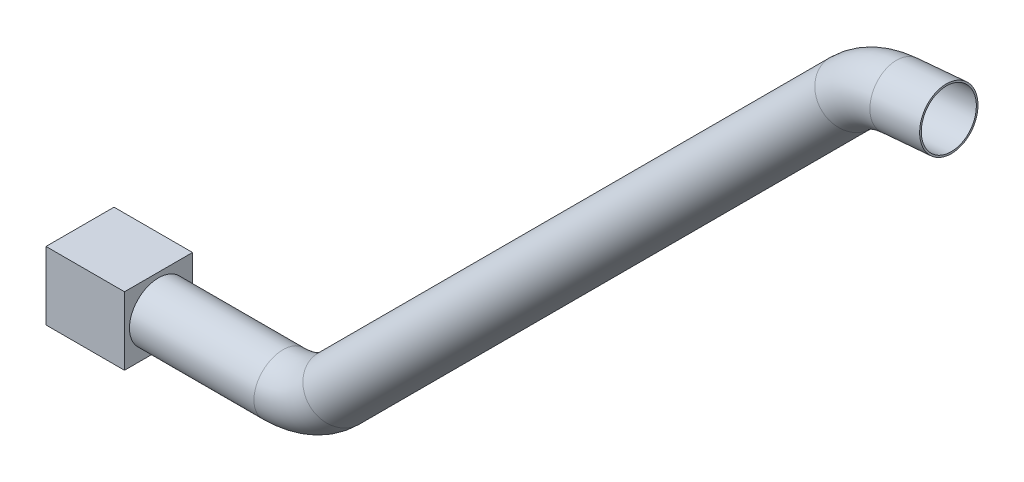
ISO-10303-21;
HEADER;
FILE_DESCRIPTION(('STEP AP214'),'2;1');
FILE_NAME('part.step','',(''),(''),'','','');
FILE_SCHEMA(('AUTOMOTIVE_DESIGN { 1 0 10303 214 1 1 1 1 }'));
ENDSEC;
DATA;
#1=APPLICATION_CONTEXT('core data for automotive mechanical design processes');
#2=APPLICATION_PROTOCOL_DEFINITION('international standard','automotive_design',2000,#1);
#3=PRODUCT_CONTEXT('',#1,'mechanical');
#4=PRODUCT('Part','Part','',(#3));
#5=PRODUCT_RELATED_PRODUCT_CATEGORY('part','',(#4));
#6=PRODUCT_DEFINITION_FORMATION('','',#4);
#7=PRODUCT_DEFINITION_CONTEXT('part definition',#1,'design');
#8=PRODUCT_DEFINITION('design','',#6,#7);
#9=PRODUCT_DEFINITION_SHAPE('','',#8);
#10=(LENGTH_UNIT() NAMED_UNIT(*) SI_UNIT(.MILLI.,.METRE.));
#11=(NAMED_UNIT(*) PLANE_ANGLE_UNIT() SI_UNIT($,.RADIAN.));
#12=(NAMED_UNIT(*) SI_UNIT($,.STERADIAN.) SOLID_ANGLE_UNIT());
#13=UNCERTAINTY_MEASURE_WITH_UNIT(LENGTH_MEASURE(1.E-05),#10,'distance_accuracy_value','');
#14=(GEOMETRIC_REPRESENTATION_CONTEXT(3) GLOBAL_UNCERTAINTY_ASSIGNED_CONTEXT((#13)) GLOBAL_UNIT_ASSIGNED_CONTEXT((#10,
#11,#12)) REPRESENTATION_CONTEXT('',''));
#15=CARTESIAN_POINT('',(0.,0.,0.));
#16=DIRECTION('',(0.,0.,1.));
#17=DIRECTION('',(1.,0.,0.));
#18=AXIS2_PLACEMENT_3D('',#15,#16,#17);
#19=CARTESIAN_POINT('',(1510.08937649358,1073.73353319197,0.));
#20=DIRECTION('',(-0.996194698091746,-0.0871557427476558,0.));
#21=DIRECTION('',(0.0871557427476558,-0.996194698091746,0.));
#22=AXIS2_PLACEMENT_3D('',#19,#20,#21);
#23=PLANE('',#22);
#24=CARTESIAN_POINT('',(1510.08937649358,1073.73353319197,0.));
#25=DIRECTION('',(-0.996194698091746,-0.0871557427476558,0.));
#26=DIRECTION('',(0.0871557427476558,-0.996194698091746,0.));
#27=AXIS2_PLACEMENT_3D('',#24,#25,#26);
#28=CIRCLE('',#27,52.3875);
#29=CARTESIAN_POINT('',(1514.65524796677,1021.54538344569,0.));
#30=VERTEX_POINT('',#29);
#31=EDGE_CURVE('E142',#30,#30,#28,.T.);
#32=ORIENTED_EDGE('',*,*,#31,.T.);
#33=EDGE_LOOP('',(#32));
#34=FACE_BOUND('',#33,.T.);
#35=CARTESIAN_POINT('',(1510.08937649358,1073.73353319197,0.));
#36=DIRECTION('',(-0.996194698091746,-0.0871557427476558,0.));
#37=DIRECTION('',(0.0871557427476558,-0.996194698091746,0.));
#38=AXIS2_PLACEMENT_3D('',#35,#36,#37);
#39=CIRCLE('',#38,55.5625);
#40=CARTESIAN_POINT('',(1514.93196745,1018.38246527925,0.));
#41=VERTEX_POINT('',#40);
#42=EDGE_CURVE('E12',#41,#41,#39,.T.);
#43=ORIENTED_EDGE('',*,*,#42,.F.);
#44=EDGE_LOOP('',(#43));
#45=FACE_BOUND('',#44,.T.);
#46=ADVANCED_FACE('F47',(#34,#45),#23,.F.);
#47=CARTESIAN_POINT('',(6.66133814775094E-13,2.22044604925031E-13,0.));
#48=DIRECTION('',(1.,0.,0.));
#49=DIRECTION('',(0.,0.,-1.));
#50=AXIS2_PLACEMENT_3D('',#47,#48,#49);
#51=CYLINDRICAL_SURFACE('',#50,55.5625);
#52=CARTESIAN_POINT('',(237.867965644036,2.22044604925031E-13,0.));
#53=DIRECTION('',(-1.,0.,0.));
#54=DIRECTION('',(0.,-1.,0.));
#55=AXIS2_PLACEMENT_3D('',#52,#53,#54);
#56=CIRCLE('',#55,55.5625);
#57=CARTESIAN_POINT('',(237.867965644036,-55.5624999999997,0.));
#58=VERTEX_POINT('',#57);
#59=EDGE_CURVE('E148',#58,#58,#56,.T.);
#60=ORIENTED_EDGE('',*,*,#59,.T.);
#61=EDGE_LOOP('',(#60));
#62=FACE_BOUND('',#61,.T.);
#63=CARTESIAN_POINT('',(6.66133814775094E-13,2.22044604925031E-13,0.));
#64=DIRECTION('',(-1.,0.,0.));
#65=DIRECTION('',(0.,-1.,0.));
#66=AXIS2_PLACEMENT_3D('',#63,#64,#65);
#67=CIRCLE('',#66,55.5625);
#68=CARTESIAN_POINT('',(5.28109674047261E-13,-55.5624999999998,0.));
#69=VERTEX_POINT('',#68);
#70=EDGE_CURVE('E145',#69,#69,#67,.T.);
#71=ORIENTED_EDGE('',*,*,#70,.F.);
#72=EDGE_LOOP('',(#71));
#73=FACE_BOUND('',#72,.T.);
#74=ADVANCED_FACE('F182',(#62,#73),#51,.T.);
#75=CARTESIAN_POINT('',(237.867965644036,150.,0.));
#76=DIRECTION('',(0.,0.,1.));
#77=DIRECTION('',(1.,0.,0.));
#78=AXIS2_PLACEMENT_3D('',#75,#76,#77);
#79=TOROIDAL_SURFACE('',#78,150.,55.5625);
#80=CARTESIAN_POINT('',(343.933982822018,43.9339828220184,0.));
#81=DIRECTION('',(-0.707106781186548,-0.707106781186547,0.));
#82=DIRECTION('',(0.707106781186547,-0.707106781186548,0.));
#83=AXIS2_PLACEMENT_3D('',#80,#81,#82);
#84=CIRCLE('',#83,55.5625);
#85=CARTESIAN_POINT('',(383.222603351696,4.64536229234114,0.));
#86=VERTEX_POINT('',#85);
#87=EDGE_CURVE('E151',#86,#86,#84,.T.);
#88=CARTESIAN_POINT('',(237.867965644036,150.,0.));
#89=DIRECTION('',(0.,0.,1.));
#90=DIRECTION('',(1.,0.,0.));
#91=AXIS2_PLACEMENT_3D('',#88,#89,#90);
#92=CIRCLE('',#91,205.5625);
#93=EDGE_CURVE('',#58,#86,#92,.T.);
#94=ORIENTED_EDGE('',*,*,#59,.F.);
#95=ORIENTED_EDGE('',*,*,#87,.T.);
#96=ORIENTED_EDGE('',*,*,#93,.T.);
#97=ORIENTED_EDGE('',*,*,#93,.F.);
#98=EDGE_LOOP('',(#94,#96,#95,#97));
#99=FACE_BOUND('',#98,.T.);
#100=ADVANCED_FACE('F178',(#99),#79,.T.);
#101=CARTESIAN_POINT('',(343.933982822018,43.9339828220184,0.));
#102=DIRECTION('',(0.707106781186546,0.707106781186549,0.));
#103=DIRECTION('',(-0.707106781186549,0.707106781186546,0.));
#104=AXIS2_PLACEMENT_3D('',#101,#102,#103);
#105=CYLINDRICAL_SURFACE('',#104,55.5625);
#106=CARTESIAN_POINT('',(1322.05529865987,1022.05529865987,0.));
#107=DIRECTION('',(-0.707106781186548,-0.707106781186547,0.));
#108=DIRECTION('',(0.707106781186547,-0.707106781186548,0.));
#109=AXIS2_PLACEMENT_3D('',#106,#107,#108);
#110=CIRCLE('',#109,55.5625);
#111=CARTESIAN_POINT('',(1282.76667813019,1061.34391918955,0.));
#112=VERTEX_POINT('',#111);
#113=EDGE_CURVE('E154',#112,#112,#110,.T.);
#114=ORIENTED_EDGE('',*,*,#113,.T.);
#115=EDGE_LOOP('',(#114));
#116=FACE_BOUND('',#115,.T.);
#117=ORIENTED_EDGE('',*,*,#87,.F.);
#118=EDGE_LOOP('',(#117));
#119=FACE_BOUND('',#118,.T.);
#120=ADVANCED_FACE('F173',(#116,#119),#105,.T.);
#121=CARTESIAN_POINT('',(1428.12131583785,915.989281481888,0.));
#122=DIRECTION('',(0.,0.,-1.));
#123=DIRECTION('',(-1.,0.,0.));
#124=AXIS2_PLACEMENT_3D('',#121,#122,#123);
#125=TOROIDAL_SURFACE('',#124,150.,55.5625);
#126=CARTESIAN_POINT('',(1415.0479544257,1065.41848619565,0.));
#127=DIRECTION('',(-0.996194698091746,-0.0871557427476558,0.));
#128=DIRECTION('',(0.0871557427476558,-0.996194698091746,0.));
#129=AXIS2_PLACEMENT_3D('',#126,#127,#128);
#130=CIRCLE('',#129,55.5625);
#131=CARTESIAN_POINT('',(1410.20536346928,1120.76955410837,0.));
#132=VERTEX_POINT('',#131);
#133=EDGE_CURVE('E54',#132,#132,#130,.T.);
#134=CARTESIAN_POINT('',(1428.12131583785,915.989281481888,0.));
#135=DIRECTION('',(0.,0.,-1.));
#136=DIRECTION('',(-1.,0.,0.));
#137=AXIS2_PLACEMENT_3D('',#134,#135,#136);
#138=CIRCLE('',#137,205.5625);
#139=EDGE_CURVE('',#112,#132,#138,.T.);
#140=ORIENTED_EDGE('',*,*,#113,.F.);
#141=ORIENTED_EDGE('',*,*,#133,.T.);
#142=ORIENTED_EDGE('',*,*,#139,.T.);
#143=ORIENTED_EDGE('',*,*,#139,.F.);
#144=EDGE_LOOP('',(#140,#142,#141,#143));
#145=FACE_BOUND('',#144,.T.);
#146=ADVANCED_FACE('F159',(#145),#125,.T.);
#147=CARTESIAN_POINT('',(1415.0479544257,1065.41848619565,0.));
#148=DIRECTION('',(0.996194698091746,0.0871557427476583,0.));
#149=DIRECTION('',(-0.0871557427476583,0.996194698091746,0.));
#150=AXIS2_PLACEMENT_3D('',#147,#148,#149);
#151=CYLINDRICAL_SURFACE('',#150,55.5625);
#152=ORIENTED_EDGE('',*,*,#42,.T.);
#153=EDGE_LOOP('',(#152));
#154=FACE_BOUND('',#153,.T.);
#155=ORIENTED_EDGE('',*,*,#133,.F.);
#156=EDGE_LOOP('',(#155));
#157=FACE_BOUND('',#156,.T.);
#158=ADVANCED_FACE('F162',(#154,#157),#151,.T.);
#159=CARTESIAN_POINT('',(3.17500000000067,2.14113449192865E-13,0.));
#160=DIRECTION('',(-1.,0.,0.));
#161=DIRECTION('',(0.,-1.,0.));
#162=AXIS2_PLACEMENT_3D('',#159,#160,#161);
#163=PLANE('',#162);
#164=CARTESIAN_POINT('',(3.17500000000067,2.22044604925031E-13,0.));
#165=DIRECTION('',(-1.,0.,0.));
#166=DIRECTION('',(0.,-1.,0.));
#167=AXIS2_PLACEMENT_3D('',#164,#165,#166);
#168=CIRCLE('',#167,52.3875);
#169=CARTESIAN_POINT('',(3.17500000000054,-52.3874999999998,0.));
#170=VERTEX_POINT('',#169);
#171=EDGE_CURVE('E127',#170,#170,#168,.T.);
#172=ORIENTED_EDGE('',*,*,#171,.F.);
#173=EDGE_LOOP('',(#172));
#174=FACE_BOUND('',#173,.T.);
#175=ADVANCED_FACE('F164',(#174),#163,.F.);
#176=CARTESIAN_POINT('',(6.66133814775094E-13,2.22044604925031E-13,0.));
#177=DIRECTION('',(1.,0.,0.));
#178=DIRECTION('',(0.,0.,-1.));
#179=AXIS2_PLACEMENT_3D('',#176,#177,#178);
#180=CYLINDRICAL_SURFACE('',#179,52.3875);
#181=CARTESIAN_POINT('',(237.867965644036,2.22044604925031E-13,0.));
#182=DIRECTION('',(1.,0.,0.));
#183=DIRECTION('',(0.,0.,-1.));
#184=AXIS2_PLACEMENT_3D('',#181,#182,#183);
#185=CIRCLE('',#184,52.3875);
#186=CARTESIAN_POINT('',(237.867965644036,-52.3874999999997,0.));
#187=VERTEX_POINT('',#186);
#188=EDGE_CURVE('E130',#187,#187,#185,.F.);
#189=ORIENTED_EDGE('',*,*,#188,.F.);
#190=EDGE_LOOP('',(#189));
#191=FACE_BOUND('',#190,.T.);
#192=ORIENTED_EDGE('',*,*,#171,.T.);
#193=EDGE_LOOP('',(#192));
#194=FACE_BOUND('',#193,.T.);
#195=ADVANCED_FACE('F169',(#191,#194),#180,.F.);
#196=CARTESIAN_POINT('',(237.867965644036,150.,0.));
#197=DIRECTION('',(0.,0.,1.));
#198=DIRECTION('',(1.,0.,0.));
#199=AXIS2_PLACEMENT_3D('',#196,#197,#198);
#200=TOROIDAL_SURFACE('',#199,150.,52.3875);
#201=CARTESIAN_POINT('',(343.933982822018,43.9339828220188,0.));
#202=DIRECTION('',(-0.707106781186543,-0.707106781186552,0.));
#203=DIRECTION('',(0.707106781186552,-0.707106781186543,0.));
#204=AXIS2_PLACEMENT_3D('',#201,#202,#203);
#205=CIRCLE('',#204,52.3875);
#206=CARTESIAN_POINT('',(380.977539321429,6.89042632260881,0.));
#207=VERTEX_POINT('',#206);
#208=EDGE_CURVE('E133',#207,#207,#205,.T.);
#209=CARTESIAN_POINT('',(237.867965644036,150.,0.));
#210=DIRECTION('',(0.,0.,1.));
#211=DIRECTION('',(1.,0.,0.));
#212=AXIS2_PLACEMENT_3D('',#209,#210,#211);
#213=CIRCLE('',#212,202.3875);
#214=EDGE_CURVE('',#187,#207,#213,.T.);
#215=ORIENTED_EDGE('',*,*,#188,.T.);
#216=ORIENTED_EDGE('',*,*,#208,.F.);
#217=ORIENTED_EDGE('',*,*,#214,.T.);
#218=ORIENTED_EDGE('',*,*,#214,.F.);
#219=EDGE_LOOP('',(#215,#217,#216,#218));
#220=FACE_BOUND('',#219,.T.);
#221=ADVANCED_FACE('F198',(#220),#200,.F.);
#222=CARTESIAN_POINT('',(343.933982822018,43.9339828220184,0.));
#223=DIRECTION('',(0.707106781186546,0.707106781186549,0.));
#224=DIRECTION('',(-0.707106781186549,0.707106781186546,0.));
#225=AXIS2_PLACEMENT_3D('',#222,#223,#224);
#226=CYLINDRICAL_SURFACE('',#225,52.3875);
#227=CARTESIAN_POINT('',(1322.05529865987,1022.05529865987,0.));
#228=DIRECTION('',(0.707106781186546,0.707106781186549,0.));
#229=DIRECTION('',(-0.707106781186549,0.707106781186546,0.));
#230=AXIS2_PLACEMENT_3D('',#227,#228,#229);
#231=CIRCLE('',#230,52.3875);
#232=CARTESIAN_POINT('',(1285.01174216046,1059.09885515928,0.));
#233=VERTEX_POINT('',#232);
#234=EDGE_CURVE('E136',#233,#233,#231,.F.);
#235=ORIENTED_EDGE('',*,*,#234,.F.);
#236=EDGE_LOOP('',(#235));
#237=FACE_BOUND('',#236,.T.);
#238=ORIENTED_EDGE('',*,*,#208,.T.);
#239=EDGE_LOOP('',(#238));
#240=FACE_BOUND('',#239,.T.);
#241=ADVANCED_FACE('F194',(#237,#240),#226,.F.);
#242=CARTESIAN_POINT('',(1428.12131583785,915.989281481888,0.));
#243=DIRECTION('',(0.,0.,-1.));
#244=DIRECTION('',(-1.,0.,0.));
#245=AXIS2_PLACEMENT_3D('',#242,#243,#244);
#246=TOROIDAL_SURFACE('',#245,150.,52.3875);
#247=CARTESIAN_POINT('',(1415.0479544257,1065.41848619565,0.));
#248=DIRECTION('',(-0.996194698091746,-0.0871557427476548,0.));
#249=DIRECTION('',(0.0871557427476548,-0.996194698091746,0.));
#250=AXIS2_PLACEMENT_3D('',#247,#248,#249);
#251=CIRCLE('',#250,52.3875);
#252=CARTESIAN_POINT('',(1410.48208295251,1117.60663594193,0.));
#253=VERTEX_POINT('',#252);
#254=EDGE_CURVE('E139',#253,#253,#251,.T.);
#255=CARTESIAN_POINT('',(1428.12131583785,915.989281481888,0.));
#256=DIRECTION('',(0.,0.,-1.));
#257=DIRECTION('',(-1.,0.,0.));
#258=AXIS2_PLACEMENT_3D('',#255,#256,#257);
#259=CIRCLE('',#258,202.3875);
#260=EDGE_CURVE('',#233,#253,#259,.T.);
#261=ORIENTED_EDGE('',*,*,#234,.T.);
#262=ORIENTED_EDGE('',*,*,#254,.F.);
#263=ORIENTED_EDGE('',*,*,#260,.T.);
#264=ORIENTED_EDGE('',*,*,#260,.F.);
#265=EDGE_LOOP('',(#261,#263,#262,#264));
#266=FACE_BOUND('',#265,.T.);
#267=ADVANCED_FACE('F190',(#266),#246,.F.);
#268=CARTESIAN_POINT('',(1415.0479544257,1065.41848619565,0.));
#269=DIRECTION('',(0.996194698091746,0.0871557427476583,0.));
#270=DIRECTION('',(-0.0871557427476583,0.996194698091746,0.));
#271=AXIS2_PLACEMENT_3D('',#268,#269,#270);
#272=CYLINDRICAL_SURFACE('',#271,52.3875);
#273=ORIENTED_EDGE('',*,*,#31,.F.);
#274=EDGE_LOOP('',(#273));
#275=FACE_BOUND('',#274,.T.);
#276=ORIENTED_EDGE('',*,*,#254,.T.);
#277=EDGE_LOOP('',(#276));
#278=FACE_BOUND('',#277,.T.);
#279=ADVANCED_FACE('F187',(#275,#278),#272,.F.);
#280=CARTESIAN_POINT('',(-150.,65.,65.));
#281=DIRECTION('',(0.,0.,-1.));
#282=DIRECTION('',(-1.,0.,0.));
#283=AXIS2_PLACEMENT_3D('',#280,#281,#282);
#284=PLANE('',#283);
#285=DIRECTION('',(0.,1.,0.));
#286=VECTOR('',#285,1.);
#287=CARTESIAN_POINT('',(0.,65.,65.));
#288=LINE('',#287,#286);
#289=CARTESIAN_POINT('',(0.,-65.,65.));
#290=VERTEX_POINT('',#289);
#291=CARTESIAN_POINT('',(0.,65.,65.));
#292=VERTEX_POINT('',#291);
#293=EDGE_CURVE('E117',#290,#292,#288,.T.);
#294=ORIENTED_EDGE('',*,*,#293,.T.);
#295=DIRECTION('',(1.,0.,0.));
#296=VECTOR('',#295,1.);
#297=CARTESIAN_POINT('',(-150.,65.,65.));
#298=LINE('',#297,#296);
#299=CARTESIAN_POINT('',(-150.,65.,65.));
#300=VERTEX_POINT('',#299);
#301=EDGE_CURVE('E108',#300,#292,#298,.T.);
#302=ORIENTED_EDGE('',*,*,#301,.F.);
#303=DIRECTION('',(0.,1.,0.));
#304=VECTOR('',#303,1.);
#305=CARTESIAN_POINT('',(-150.,65.,65.));
#306=LINE('',#305,#304);
#307=CARTESIAN_POINT('',(-150.,-65.,65.));
#308=VERTEX_POINT('',#307);
#309=EDGE_CURVE('E99',#308,#300,#306,.T.);
#310=ORIENTED_EDGE('',*,*,#309,.F.);
#311=DIRECTION('',(1.,0.,0.));
#312=VECTOR('',#311,1.);
#313=CARTESIAN_POINT('',(-150.,-65.,65.));
#314=LINE('',#313,#312);
#315=EDGE_CURVE('E113',#308,#290,#314,.T.);
#316=ORIENTED_EDGE('',*,*,#315,.T.);
#317=EDGE_LOOP('',(#294,#302,#310,#316));
#318=FACE_BOUND('',#317,.T.);
#319=ADVANCED_FACE('F172',(#318),#284,.F.);
#320=CARTESIAN_POINT('',(-150.,65.,-65.));
#321=DIRECTION('',(0.,-1.,0.));
#322=DIRECTION('',(0.,0.,-1.));
#323=AXIS2_PLACEMENT_3D('',#320,#321,#322);
#324=PLANE('',#323);
#325=DIRECTION('',(0.,0.,-1.));
#326=VECTOR('',#325,1.);
#327=CARTESIAN_POINT('',(0.,65.,-65.));
#328=LINE('',#327,#326);
#329=CARTESIAN_POINT('',(0.,65.,-65.));
#330=VERTEX_POINT('',#329);
#331=EDGE_CURVE('E105',#292,#330,#328,.T.);
#332=ORIENTED_EDGE('',*,*,#331,.T.);
#333=DIRECTION('',(1.,0.,0.));
#334=VECTOR('',#333,1.);
#335=CARTESIAN_POINT('',(-150.,65.,-65.));
#336=LINE('',#335,#334);
#337=CARTESIAN_POINT('',(-150.,65.,-65.));
#338=VERTEX_POINT('',#337);
#339=EDGE_CURVE('E103',#338,#330,#336,.T.);
#340=ORIENTED_EDGE('',*,*,#339,.F.);
#341=DIRECTION('',(0.,0.,-1.));
#342=VECTOR('',#341,1.);
#343=CARTESIAN_POINT('',(-150.,65.,-65.));
#344=LINE('',#343,#342);
#345=EDGE_CURVE('E93',#300,#338,#344,.T.);
#346=ORIENTED_EDGE('',*,*,#345,.F.);
#347=ORIENTED_EDGE('',*,*,#301,.T.);
#348=EDGE_LOOP('',(#332,#340,#346,#347));
#349=FACE_BOUND('',#348,.T.);
#350=ADVANCED_FACE('F104',(#349),#324,.F.);
#351=CARTESIAN_POINT('',(-150.,65.,-65.));
#352=DIRECTION('',(0.,0.,1.));
#353=DIRECTION('',(0.,-1.,0.));
#354=AXIS2_PLACEMENT_3D('',#351,#352,#353);
#355=PLANE('',#354);
#356=DIRECTION('',(0.,-1.,0.));
#357=VECTOR('',#356,1.);
#358=CARTESIAN_POINT('',(0.,65.,-65.));
#359=LINE('',#358,#357);
#360=CARTESIAN_POINT('',(0.,-65.,-65.));
#361=VERTEX_POINT('',#360);
#362=EDGE_CURVE('E121',#330,#361,#359,.T.);
#363=ORIENTED_EDGE('',*,*,#362,.T.);
#364=DIRECTION('',(1.,0.,0.));
#365=VECTOR('',#364,1.);
#366=CARTESIAN_POINT('',(-150.,-65.,-65.));
#367=LINE('',#366,#365);
#368=CARTESIAN_POINT('',(-150.,-65.,-65.));
#369=VERTEX_POINT('',#368);
#370=EDGE_CURVE('E109',#369,#361,#367,.T.);
#371=ORIENTED_EDGE('',*,*,#370,.F.);
#372=DIRECTION('',(0.,-1.,0.));
#373=VECTOR('',#372,1.);
#374=CARTESIAN_POINT('',(-150.,65.,-65.));
#375=LINE('',#374,#373);
#376=EDGE_CURVE('E96',#338,#369,#375,.T.);
#377=ORIENTED_EDGE('',*,*,#376,.F.);
#378=ORIENTED_EDGE('',*,*,#339,.T.);
#379=EDGE_LOOP('',(#363,#371,#377,#378));
#380=FACE_BOUND('',#379,.T.);
#381=ADVANCED_FACE('F111',(#380),#355,.F.);
#382=CARTESIAN_POINT('',(-150.,-65.,-65.));
#383=DIRECTION('',(0.,1.,0.));
#384=DIRECTION('',(0.,0.,1.));
#385=AXIS2_PLACEMENT_3D('',#382,#383,#384);
#386=PLANE('',#385);
#387=DIRECTION('',(0.,0.,1.));
#388=VECTOR('',#387,1.);
#389=CARTESIAN_POINT('',(0.,-65.,-65.));
#390=LINE('',#389,#388);
#391=EDGE_CURVE('E85',#361,#290,#390,.T.);
#392=ORIENTED_EDGE('',*,*,#391,.T.);
#393=ORIENTED_EDGE('',*,*,#315,.F.);
#394=DIRECTION('',(0.,0.,1.));
#395=VECTOR('',#394,1.);
#396=CARTESIAN_POINT('',(-150.,-65.,-65.));
#397=LINE('',#396,#395);
#398=EDGE_CURVE('E65',#369,#308,#397,.T.);
#399=ORIENTED_EDGE('',*,*,#398,.F.);
#400=ORIENTED_EDGE('',*,*,#370,.T.);
#401=EDGE_LOOP('',(#392,#393,#399,#400));
#402=FACE_BOUND('',#401,.T.);
#403=ADVANCED_FACE('F213',(#402),#386,.F.);
#404=CARTESIAN_POINT('',(-150.,0.,0.));
#405=DIRECTION('',(-1.,0.,0.));
#406=DIRECTION('',(0.,0.,1.));
#407=AXIS2_PLACEMENT_3D('',#404,#405,#406);
#408=PLANE('',#407);
#409=ORIENTED_EDGE('',*,*,#309,.T.);
#410=ORIENTED_EDGE('',*,*,#345,.T.);
#411=ORIENTED_EDGE('',*,*,#376,.T.);
#412=ORIENTED_EDGE('',*,*,#398,.T.);
#413=EDGE_LOOP('',(#409,#410,#411,#412));
#414=FACE_BOUND('',#413,.T.);
#415=ADVANCED_FACE('F94',(#414),#408,.T.);
#416=CARTESIAN_POINT('',(0.,0.,0.));
#417=DIRECTION('',(-1.,0.,0.));
#418=DIRECTION('',(0.,0.,1.));
#419=AXIS2_PLACEMENT_3D('',#416,#417,#418);
#420=PLANE('',#419);
#421=ORIENTED_EDGE('',*,*,#70,.T.);
#422=EDGE_LOOP('',(#421));
#423=FACE_BOUND('',#422,.T.);
#424=ORIENTED_EDGE('',*,*,#293,.F.);
#425=ORIENTED_EDGE('',*,*,#391,.F.);
#426=ORIENTED_EDGE('',*,*,#362,.F.);
#427=ORIENTED_EDGE('',*,*,#331,.F.);
#428=EDGE_LOOP('',(#424,#425,#426,#427));
#429=FACE_BOUND('',#428,.T.);
#430=ADVANCED_FACE('F216',(#423,#429),#420,.F.);
#431=CLOSED_SHELL('',(#46,#74,#100,#120,#146,#158,#175,#195,#221,#241,#267,#279,#319,#350,#381,
#403,#415,#430));
#432=MANIFOLD_SOLID_BREP('B2',#431);
#433=ADVANCED_BREP_SHAPE_REPRESENTATION('',(#18,#432),#14);
#434=SHAPE_DEFINITION_REPRESENTATION(#9,#433);
ENDSEC;
END-ISO-10303-21;
